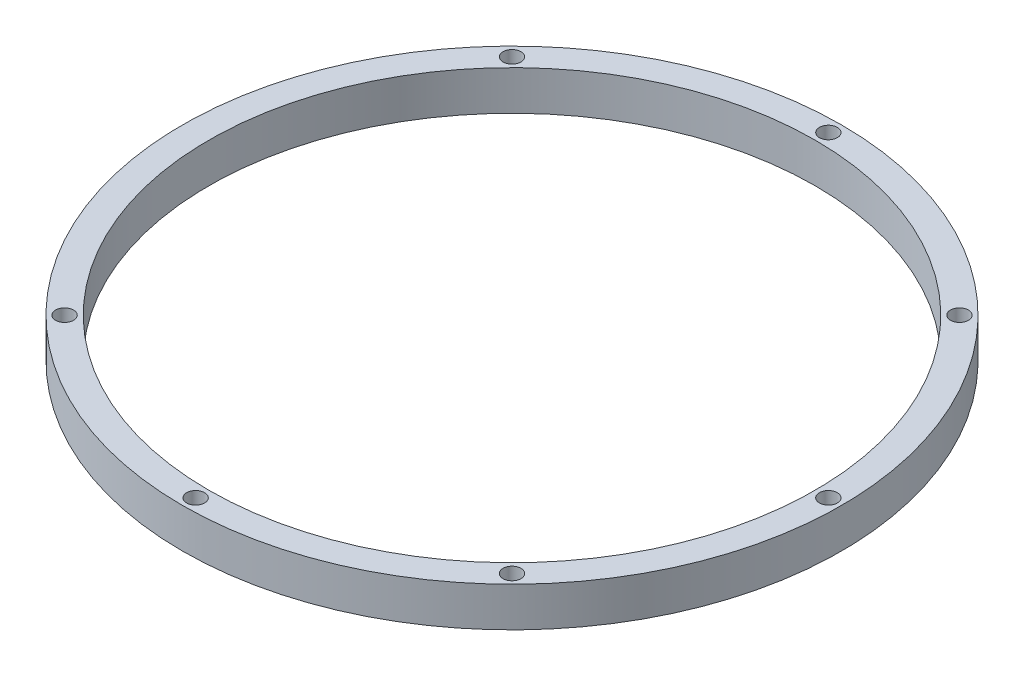
ISO-10303-21;
HEADER;
FILE_DESCRIPTION(('STEP AP214'),'2;1');
FILE_NAME('part.step','',(''),(''),'','','');
FILE_SCHEMA(('AUTOMOTIVE_DESIGN { 1 0 10303 214 1 1 1 1 }'));
ENDSEC;
DATA;
#1=APPLICATION_CONTEXT('core data for automotive mechanical design processes');
#2=APPLICATION_PROTOCOL_DEFINITION('international standard','automotive_design',2000,#1);
#3=PRODUCT_CONTEXT('',#1,'mechanical');
#4=PRODUCT('Part','Part','',(#3));
#5=PRODUCT_RELATED_PRODUCT_CATEGORY('part','',(#4));
#6=PRODUCT_DEFINITION_FORMATION('','',#4);
#7=PRODUCT_DEFINITION_CONTEXT('part definition',#1,'design');
#8=PRODUCT_DEFINITION('design','',#6,#7);
#9=PRODUCT_DEFINITION_SHAPE('','',#8);
#10=(LENGTH_UNIT() NAMED_UNIT(*) SI_UNIT(.MILLI.,.METRE.));
#11=(NAMED_UNIT(*) PLANE_ANGLE_UNIT() SI_UNIT($,.RADIAN.));
#12=(NAMED_UNIT(*) SI_UNIT($,.STERADIAN.) SOLID_ANGLE_UNIT());
#13=UNCERTAINTY_MEASURE_WITH_UNIT(LENGTH_MEASURE(1.E-05),#10,'distance_accuracy_value','');
#14=(GEOMETRIC_REPRESENTATION_CONTEXT(3) GLOBAL_UNCERTAINTY_ASSIGNED_CONTEXT((#13)) GLOBAL_UNIT_ASSIGNED_CONTEXT((#10,
#11,#12)) REPRESENTATION_CONTEXT('',''));
#15=CARTESIAN_POINT('',(0.,0.,0.));
#16=DIRECTION('',(0.,0.,1.));
#17=DIRECTION('',(1.,0.,0.));
#18=AXIS2_PLACEMENT_3D('',#15,#16,#17);
#19=CARTESIAN_POINT('',(0.,3.75,0.));
#20=DIRECTION('',(0.,1.,0.));
#21=DIRECTION('',(0.,0.,1.));
#22=AXIS2_PLACEMENT_3D('',#19,#20,#21);
#23=PLANE('',#22);
#24=CARTESIAN_POINT('',(0.,3.75,-60.));
#25=DIRECTION('',(0.,1.,0.));
#26=DIRECTION('',(0.,0.,1.));
#27=AXIS2_PLACEMENT_3D('',#24,#25,#26);
#28=CIRCLE('',#27,1.7);
#29=CARTESIAN_POINT('',(0.,3.75,-58.3));
#30=VERTEX_POINT('',#29);
#31=EDGE_CURVE('E85',#30,#30,#28,.T.);
#32=ORIENTED_EDGE('',*,*,#31,.F.);
#33=EDGE_LOOP('',(#32));
#34=FACE_BOUND('',#33,.T.);
#35=CARTESIAN_POINT('',(-42.4264068711928,3.75,42.4264068711929));
#36=DIRECTION('',(0.,1.,0.));
#37=DIRECTION('',(0.,0.,1.));
#38=AXIS2_PLACEMENT_3D('',#35,#36,#37);
#39=CIRCLE('',#38,1.7);
#40=CARTESIAN_POINT('',(-42.4264068711928,3.75,44.1264068711929));
#41=VERTEX_POINT('',#40);
#42=EDGE_CURVE('E73',#41,#41,#39,.T.);
#43=ORIENTED_EDGE('',*,*,#42,.F.);
#44=EDGE_LOOP('',(#43));
#45=FACE_BOUND('',#44,.T.);
#46=CARTESIAN_POINT('',(42.4264068711929,3.75,42.4264068711928));
#47=DIRECTION('',(0.,1.,0.));
#48=DIRECTION('',(0.,0.,1.));
#49=AXIS2_PLACEMENT_3D('',#46,#47,#48);
#50=CIRCLE('',#49,1.7);
#51=CARTESIAN_POINT('',(42.4264068711929,3.75,44.1264068711928));
#52=VERTEX_POINT('',#51);
#53=EDGE_CURVE('E61',#52,#52,#50,.T.);
#54=ORIENTED_EDGE('',*,*,#53,.F.);
#55=EDGE_LOOP('',(#54));
#56=FACE_BOUND('',#55,.T.);
#57=CARTESIAN_POINT('',(0.,3.75,0.));
#58=DIRECTION('',(0.,1.,0.));
#59=DIRECTION('',(0.,0.,1.));
#60=AXIS2_PLACEMENT_3D('',#57,#58,#59);
#61=CIRCLE('',#60,57.5);
#62=CARTESIAN_POINT('',(0.,3.75,57.5));
#63=VERTEX_POINT('',#62);
#64=EDGE_CURVE('E50',#63,#63,#61,.T.);
#65=ORIENTED_EDGE('',*,*,#64,.F.);
#66=EDGE_LOOP('',(#65));
#67=FACE_BOUND('',#66,.T.);
#68=CARTESIAN_POINT('',(0.,3.75,0.));
#69=DIRECTION('',(0.,1.,0.));
#70=DIRECTION('',(0.,0.,1.));
#71=AXIS2_PLACEMENT_3D('',#68,#69,#70);
#72=CIRCLE('',#71,62.5);
#73=CARTESIAN_POINT('',(0.,3.75,62.5));
#74=VERTEX_POINT('',#73);
#75=EDGE_CURVE('E10',#74,#74,#72,.T.);
#76=ORIENTED_EDGE('',*,*,#75,.T.);
#77=EDGE_LOOP('',(#76));
#78=FACE_BOUND('',#77,.T.);
#79=CARTESIAN_POINT('',(0.,3.75,60.));
#80=DIRECTION('',(0.,1.,0.));
#81=DIRECTION('',(0.,0.,1.));
#82=AXIS2_PLACEMENT_3D('',#79,#80,#81);
#83=CIRCLE('',#82,1.7);
#84=CARTESIAN_POINT('',(0.,3.75,61.7));
#85=VERTEX_POINT('',#84);
#86=EDGE_CURVE('E55',#85,#85,#83,.T.);
#87=ORIENTED_EDGE('',*,*,#86,.F.);
#88=EDGE_LOOP('',(#87));
#89=FACE_BOUND('',#88,.T.);
#90=CARTESIAN_POINT('',(60.,3.75,0.));
#91=DIRECTION('',(0.,1.,0.));
#92=DIRECTION('',(0.,0.,1.));
#93=AXIS2_PLACEMENT_3D('',#90,#91,#92);
#94=CIRCLE('',#93,1.7);
#95=CARTESIAN_POINT('',(60.,3.75,1.7));
#96=VERTEX_POINT('',#95);
#97=EDGE_CURVE('E67',#96,#96,#94,.T.);
#98=ORIENTED_EDGE('',*,*,#97,.F.);
#99=EDGE_LOOP('',(#98));
#100=FACE_BOUND('',#99,.T.);
#101=CARTESIAN_POINT('',(42.4264068711929,3.75,-42.4264068711929));
#102=DIRECTION('',(0.,1.,0.));
#103=DIRECTION('',(0.,0.,1.));
#104=AXIS2_PLACEMENT_3D('',#101,#102,#103);
#105=CIRCLE('',#104,1.7);
#106=CARTESIAN_POINT('',(42.4264068711929,3.75,-40.7264068711929));
#107=VERTEX_POINT('',#106);
#108=EDGE_CURVE('E79',#107,#107,#105,.T.);
#109=ORIENTED_EDGE('',*,*,#108,.F.);
#110=EDGE_LOOP('',(#109));
#111=FACE_BOUND('',#110,.T.);
#112=CARTESIAN_POINT('',(-42.4264068711929,3.75,-42.4264068711929));
#113=DIRECTION('',(0.,1.,0.));
#114=DIRECTION('',(0.,0.,1.));
#115=AXIS2_PLACEMENT_3D('',#112,#113,#114);
#116=CIRCLE('',#115,1.7);
#117=CARTESIAN_POINT('',(-42.4264068711929,3.75,-40.7264068711929));
#118=VERTEX_POINT('',#117);
#119=EDGE_CURVE('E91',#118,#118,#116,.T.);
#120=ORIENTED_EDGE('',*,*,#119,.F.);
#121=EDGE_LOOP('',(#120));
#122=FACE_BOUND('',#121,.T.);
#123=ADVANCED_FACE('F39',(#34,#45,#56,#67,#78,#89,#100,#111,#122),#23,.T.);
#124=CARTESIAN_POINT('',(0.,-3.75,0.));
#125=DIRECTION('',(0.,1.,0.));
#126=DIRECTION('',(0.,0.,1.));
#127=AXIS2_PLACEMENT_3D('',#124,#125,#126);
#128=PLANE('',#127);
#129=CARTESIAN_POINT('',(0.,-3.75,0.));
#130=DIRECTION('',(0.,1.,0.));
#131=DIRECTION('',(0.,0.,1.));
#132=AXIS2_PLACEMENT_3D('',#129,#130,#131);
#133=CIRCLE('',#132,62.5);
#134=CARTESIAN_POINT('',(0.,-3.75,62.5));
#135=VERTEX_POINT('',#134);
#136=EDGE_CURVE('E43',#135,#135,#133,.T.);
#137=ORIENTED_EDGE('',*,*,#136,.F.);
#138=EDGE_LOOP('',(#137));
#139=FACE_BOUND('',#138,.T.);
#140=CARTESIAN_POINT('',(0.,-3.75,0.));
#141=DIRECTION('',(0.,1.,0.));
#142=DIRECTION('',(0.,0.,1.));
#143=AXIS2_PLACEMENT_3D('',#140,#141,#142);
#144=CIRCLE('',#143,57.5);
#145=CARTESIAN_POINT('',(0.,-3.75,57.5));
#146=VERTEX_POINT('',#145);
#147=EDGE_CURVE('E52',#146,#146,#144,.T.);
#148=ORIENTED_EDGE('',*,*,#147,.T.);
#149=EDGE_LOOP('',(#148));
#150=FACE_BOUND('',#149,.T.);
#151=CARTESIAN_POINT('',(0.,-3.75,60.));
#152=DIRECTION('',(0.,1.,0.));
#153=DIRECTION('',(0.,0.,1.));
#154=AXIS2_PLACEMENT_3D('',#151,#152,#153);
#155=CIRCLE('',#154,1.7);
#156=CARTESIAN_POINT('',(0.,-3.75,61.7));
#157=VERTEX_POINT('',#156);
#158=EDGE_CURVE('E58',#157,#157,#155,.T.);
#159=ORIENTED_EDGE('',*,*,#158,.T.);
#160=EDGE_LOOP('',(#159));
#161=FACE_BOUND('',#160,.T.);
#162=CARTESIAN_POINT('',(42.4264068711929,-3.75,42.4264068711928));
#163=DIRECTION('',(0.,1.,0.));
#164=DIRECTION('',(0.,0.,1.));
#165=AXIS2_PLACEMENT_3D('',#162,#163,#164);
#166=CIRCLE('',#165,1.7);
#167=CARTESIAN_POINT('',(42.4264068711929,-3.75,44.1264068711928));
#168=VERTEX_POINT('',#167);
#169=EDGE_CURVE('E64',#168,#168,#166,.T.);
#170=ORIENTED_EDGE('',*,*,#169,.T.);
#171=EDGE_LOOP('',(#170));
#172=FACE_BOUND('',#171,.T.);
#173=CARTESIAN_POINT('',(60.,-3.75,0.));
#174=DIRECTION('',(0.,1.,0.));
#175=DIRECTION('',(0.,0.,1.));
#176=AXIS2_PLACEMENT_3D('',#173,#174,#175);
#177=CIRCLE('',#176,1.7);
#178=CARTESIAN_POINT('',(60.,-3.75,1.7));
#179=VERTEX_POINT('',#178);
#180=EDGE_CURVE('E70',#179,#179,#177,.T.);
#181=ORIENTED_EDGE('',*,*,#180,.T.);
#182=EDGE_LOOP('',(#181));
#183=FACE_BOUND('',#182,.T.);
#184=CARTESIAN_POINT('',(-42.4264068711928,-3.75,42.4264068711929));
#185=DIRECTION('',(0.,1.,0.));
#186=DIRECTION('',(0.,0.,1.));
#187=AXIS2_PLACEMENT_3D('',#184,#185,#186);
#188=CIRCLE('',#187,1.7);
#189=CARTESIAN_POINT('',(-42.4264068711928,-3.75,44.1264068711929));
#190=VERTEX_POINT('',#189);
#191=EDGE_CURVE('E76',#190,#190,#188,.T.);
#192=ORIENTED_EDGE('',*,*,#191,.T.);
#193=EDGE_LOOP('',(#192));
#194=FACE_BOUND('',#193,.T.);
#195=CARTESIAN_POINT('',(42.4264068711929,-3.75,-42.4264068711929));
#196=DIRECTION('',(0.,1.,0.));
#197=DIRECTION('',(0.,0.,1.));
#198=AXIS2_PLACEMENT_3D('',#195,#196,#197);
#199=CIRCLE('',#198,1.7);
#200=CARTESIAN_POINT('',(42.4264068711929,-3.75,-40.7264068711929));
#201=VERTEX_POINT('',#200);
#202=EDGE_CURVE('E82',#201,#201,#199,.T.);
#203=ORIENTED_EDGE('',*,*,#202,.T.);
#204=EDGE_LOOP('',(#203));
#205=FACE_BOUND('',#204,.T.);
#206=CARTESIAN_POINT('',(0.,-3.75,-60.));
#207=DIRECTION('',(0.,1.,0.));
#208=DIRECTION('',(0.,0.,1.));
#209=AXIS2_PLACEMENT_3D('',#206,#207,#208);
#210=CIRCLE('',#209,1.7);
#211=CARTESIAN_POINT('',(0.,-3.75,-58.3));
#212=VERTEX_POINT('',#211);
#213=EDGE_CURVE('E88',#212,#212,#210,.T.);
#214=ORIENTED_EDGE('',*,*,#213,.T.);
#215=EDGE_LOOP('',(#214));
#216=FACE_BOUND('',#215,.T.);
#217=CARTESIAN_POINT('',(-42.4264068711929,-3.75,-42.4264068711929));
#218=DIRECTION('',(0.,1.,0.));
#219=DIRECTION('',(0.,0.,1.));
#220=AXIS2_PLACEMENT_3D('',#217,#218,#219);
#221=CIRCLE('',#220,1.7);
#222=CARTESIAN_POINT('',(-42.4264068711929,-3.75,-40.7264068711929));
#223=VERTEX_POINT('',#222);
#224=EDGE_CURVE('E94',#223,#223,#221,.T.);
#225=ORIENTED_EDGE('',*,*,#224,.T.);
#226=EDGE_LOOP('',(#225));
#227=FACE_BOUND('',#226,.T.);
#228=ADVANCED_FACE('F104',(#139,#150,#161,#172,#183,#194,#205,#216,#227),#128,.F.);
#229=CARTESIAN_POINT('',(0.,3.75,0.));
#230=DIRECTION('',(0.,-1.,0.));
#231=DIRECTION('',(0.,0.,-1.));
#232=AXIS2_PLACEMENT_3D('',#229,#230,#231);
#233=CYLINDRICAL_SURFACE('',#232,62.5);
#234=ORIENTED_EDGE('',*,*,#75,.F.);
#235=EDGE_LOOP('',(#234));
#236=FACE_BOUND('',#235,.T.);
#237=ORIENTED_EDGE('',*,*,#136,.T.);
#238=EDGE_LOOP('',(#237));
#239=FACE_BOUND('',#238,.T.);
#240=ADVANCED_FACE('F41',(#236,#239),#233,.T.);
#241=CARTESIAN_POINT('',(0.,3.75,0.));
#242=DIRECTION('',(0.,-1.,0.));
#243=DIRECTION('',(0.,0.,-1.));
#244=AXIS2_PLACEMENT_3D('',#241,#242,#243);
#245=CYLINDRICAL_SURFACE('',#244,57.5);
#246=ORIENTED_EDGE('',*,*,#64,.T.);
#247=EDGE_LOOP('',(#246));
#248=FACE_BOUND('',#247,.T.);
#249=ORIENTED_EDGE('',*,*,#147,.F.);
#250=EDGE_LOOP('',(#249));
#251=FACE_BOUND('',#250,.T.);
#252=ADVANCED_FACE('F114',(#248,#251),#245,.F.);
#253=CARTESIAN_POINT('',(0.,3.75,60.));
#254=DIRECTION('',(0.,-1.,0.));
#255=DIRECTION('',(0.,0.,-1.));
#256=AXIS2_PLACEMENT_3D('',#253,#254,#255);
#257=CYLINDRICAL_SURFACE('',#256,1.7);
#258=ORIENTED_EDGE('',*,*,#86,.T.);
#259=EDGE_LOOP('',(#258));
#260=FACE_BOUND('',#259,.T.);
#261=ORIENTED_EDGE('',*,*,#158,.F.);
#262=EDGE_LOOP('',(#261));
#263=FACE_BOUND('',#262,.T.);
#264=ADVANCED_FACE('F117',(#260,#263),#257,.F.);
#265=CARTESIAN_POINT('',(42.4264068711929,3.75,42.4264068711928));
#266=DIRECTION('',(0.,-1.,0.));
#267=DIRECTION('',(0.,0.,-1.));
#268=AXIS2_PLACEMENT_3D('',#265,#266,#267);
#269=CYLINDRICAL_SURFACE('',#268,1.7);
#270=ORIENTED_EDGE('',*,*,#53,.T.);
#271=EDGE_LOOP('',(#270));
#272=FACE_BOUND('',#271,.T.);
#273=ORIENTED_EDGE('',*,*,#169,.F.);
#274=EDGE_LOOP('',(#273));
#275=FACE_BOUND('',#274,.T.);
#276=ADVANCED_FACE('F121',(#272,#275),#269,.F.);
#277=CARTESIAN_POINT('',(60.,3.75,0.));
#278=DIRECTION('',(0.,-1.,0.));
#279=DIRECTION('',(0.,0.,-1.));
#280=AXIS2_PLACEMENT_3D('',#277,#278,#279);
#281=CYLINDRICAL_SURFACE('',#280,1.7);
#282=ORIENTED_EDGE('',*,*,#97,.T.);
#283=EDGE_LOOP('',(#282));
#284=FACE_BOUND('',#283,.T.);
#285=ORIENTED_EDGE('',*,*,#180,.F.);
#286=EDGE_LOOP('',(#285));
#287=FACE_BOUND('',#286,.T.);
#288=ADVANCED_FACE('F125',(#284,#287),#281,.F.);
#289=CARTESIAN_POINT('',(-42.4264068711928,3.75,42.4264068711929));
#290=DIRECTION('',(0.,-1.,0.));
#291=DIRECTION('',(0.,0.,-1.));
#292=AXIS2_PLACEMENT_3D('',#289,#290,#291);
#293=CYLINDRICAL_SURFACE('',#292,1.7);
#294=ORIENTED_EDGE('',*,*,#42,.T.);
#295=EDGE_LOOP('',(#294));
#296=FACE_BOUND('',#295,.T.);
#297=ORIENTED_EDGE('',*,*,#191,.F.);
#298=EDGE_LOOP('',(#297));
#299=FACE_BOUND('',#298,.T.);
#300=ADVANCED_FACE('F129',(#296,#299),#293,.F.);
#301=CARTESIAN_POINT('',(42.4264068711929,3.75,-42.4264068711929));
#302=DIRECTION('',(0.,-1.,0.));
#303=DIRECTION('',(0.,0.,-1.));
#304=AXIS2_PLACEMENT_3D('',#301,#302,#303);
#305=CYLINDRICAL_SURFACE('',#304,1.7);
#306=ORIENTED_EDGE('',*,*,#108,.T.);
#307=EDGE_LOOP('',(#306));
#308=FACE_BOUND('',#307,.T.);
#309=ORIENTED_EDGE('',*,*,#202,.F.);
#310=EDGE_LOOP('',(#309));
#311=FACE_BOUND('',#310,.T.);
#312=ADVANCED_FACE('F133',(#308,#311),#305,.F.);
#313=CARTESIAN_POINT('',(0.,3.75,-60.));
#314=DIRECTION('',(0.,-1.,0.));
#315=DIRECTION('',(0.,0.,-1.));
#316=AXIS2_PLACEMENT_3D('',#313,#314,#315);
#317=CYLINDRICAL_SURFACE('',#316,1.7);
#318=ORIENTED_EDGE('',*,*,#31,.T.);
#319=EDGE_LOOP('',(#318));
#320=FACE_BOUND('',#319,.T.);
#321=ORIENTED_EDGE('',*,*,#213,.F.);
#322=EDGE_LOOP('',(#321));
#323=FACE_BOUND('',#322,.T.);
#324=ADVANCED_FACE('F137',(#320,#323),#317,.F.);
#325=CARTESIAN_POINT('',(-42.4264068711929,3.75,-42.4264068711929));
#326=DIRECTION('',(0.,-1.,0.));
#327=DIRECTION('',(0.,0.,-1.));
#328=AXIS2_PLACEMENT_3D('',#325,#326,#327);
#329=CYLINDRICAL_SURFACE('',#328,1.7);
#330=ORIENTED_EDGE('',*,*,#119,.T.);
#331=EDGE_LOOP('',(#330));
#332=FACE_BOUND('',#331,.T.);
#333=ORIENTED_EDGE('',*,*,#224,.F.);
#334=EDGE_LOOP('',(#333));
#335=FACE_BOUND('',#334,.T.);
#336=ADVANCED_FACE('F100',(#332,#335),#329,.F.);
#337=CLOSED_SHELL('',(#123,#228,#240,#252,#264,#276,#288,#300,#312,#324,#336));
#338=MANIFOLD_SOLID_BREP('B2',#337);
#339=ADVANCED_BREP_SHAPE_REPRESENTATION('',(#18,#338),#14);
#340=SHAPE_DEFINITION_REPRESENTATION(#9,#339);
ENDSEC;
END-ISO-10303-21;
